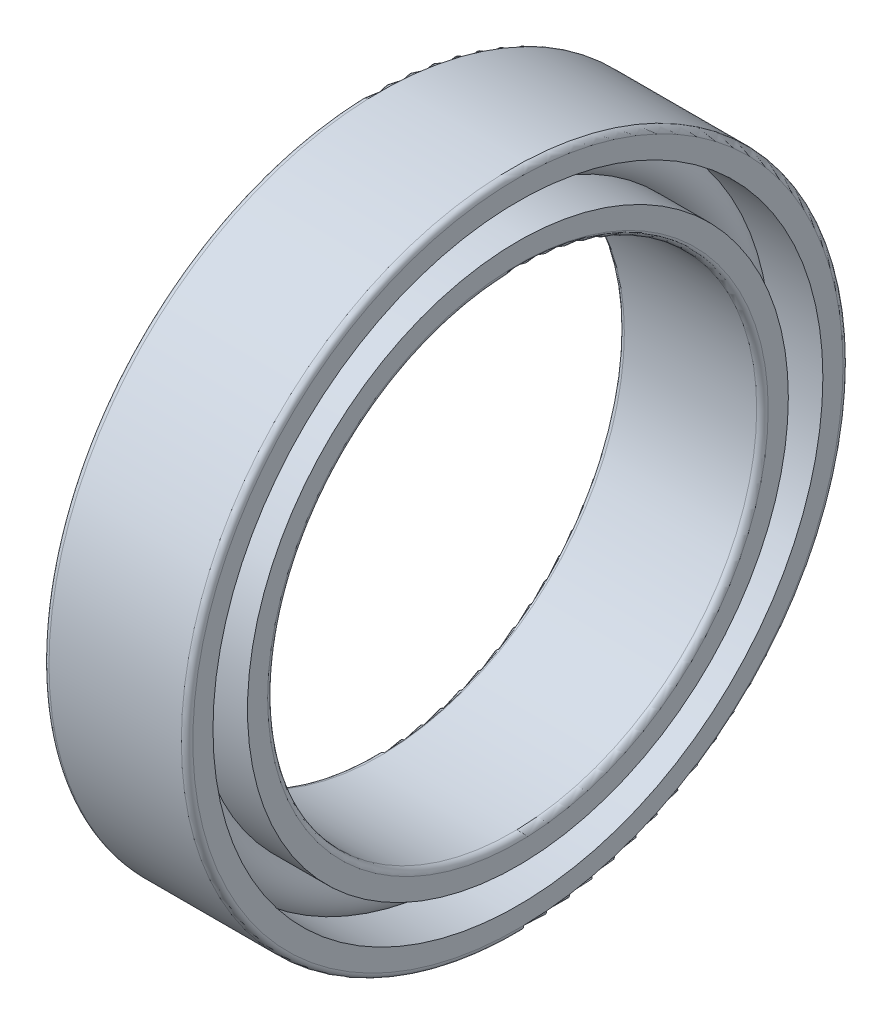
ISO-10303-21;
HEADER;
FILE_DESCRIPTION(('STEP AP214'),'2;1');
FILE_NAME('part.step','',(''),(''),'','','');
FILE_SCHEMA(('AUTOMOTIVE_DESIGN { 1 0 10303 214 1 1 1 1 }'));
ENDSEC;
DATA;
#1=APPLICATION_CONTEXT('core data for automotive mechanical design processes');
#2=APPLICATION_PROTOCOL_DEFINITION('international standard','automotive_design',2000,#1);
#3=PRODUCT_CONTEXT('',#1,'mechanical');
#4=PRODUCT('Part','Part','',(#3));
#5=PRODUCT_RELATED_PRODUCT_CATEGORY('part','',(#4));
#6=PRODUCT_DEFINITION_FORMATION('','',#4);
#7=PRODUCT_DEFINITION_CONTEXT('part definition',#1,'design');
#8=PRODUCT_DEFINITION('design','',#6,#7);
#9=PRODUCT_DEFINITION_SHAPE('','',#8);
#10=(LENGTH_UNIT() NAMED_UNIT(*) SI_UNIT(.MILLI.,.METRE.));
#11=(NAMED_UNIT(*) PLANE_ANGLE_UNIT() SI_UNIT($,.RADIAN.));
#12=(NAMED_UNIT(*) SI_UNIT($,.STERADIAN.) SOLID_ANGLE_UNIT());
#13=UNCERTAINTY_MEASURE_WITH_UNIT(LENGTH_MEASURE(1.E-05),#10,'distance_accuracy_value','');
#14=(GEOMETRIC_REPRESENTATION_CONTEXT(3) GLOBAL_UNCERTAINTY_ASSIGNED_CONTEXT((#13)) GLOBAL_UNIT_ASSIGNED_CONTEXT((#10,
#11,#12)) REPRESENTATION_CONTEXT('',''));
#15=CARTESIAN_POINT('',(0.,0.,0.));
#16=DIRECTION('',(0.,0.,1.));
#17=DIRECTION('',(1.,0.,0.));
#18=AXIS2_PLACEMENT_3D('',#15,#16,#17);
#19=CARTESIAN_POINT('',(0.,0.,0.));
#20=DIRECTION('',(-1.,0.,0.));
#21=DIRECTION('',(0.,0.,1.));
#22=AXIS2_PLACEMENT_3D('',#19,#20,#21);
#23=TOROIDAL_SURFACE('',#22,10.,0.9);
#24=CARTESIAN_POINT('',(0.670820393249932,0.,0.));
#25=DIRECTION('',(-1.,0.,0.));
#26=DIRECTION('',(0.,0.,1.));
#27=AXIS2_PLACEMENT_3D('',#24,#25,#26);
#28=CIRCLE('',#27,10.6);
#29=CARTESIAN_POINT('',(0.670820393249932,0.,10.6));
#30=VERTEX_POINT('',#29);
#31=EDGE_CURVE('E41',#30,#30,#28,.F.);
#32=ORIENTED_EDGE('',*,*,#31,.T.);
#33=EDGE_LOOP('',(#32));
#34=FACE_BOUND('',#33,.T.);
#35=CARTESIAN_POINT('',(0.670820393249935,0.,0.));
#36=DIRECTION('',(-1.,0.,0.));
#37=DIRECTION('',(0.,0.,1.));
#38=AXIS2_PLACEMENT_3D('',#35,#36,#37);
#39=CIRCLE('',#38,9.4);
#40=CARTESIAN_POINT('',(0.670820393249935,0.,9.4));
#41=VERTEX_POINT('',#40);
#42=EDGE_CURVE('E10',#41,#41,#39,.T.);
#43=ORIENTED_EDGE('',*,*,#42,.T.);
#44=EDGE_LOOP('',(#43));
#45=FACE_BOUND('',#44,.T.);
#46=ADVANCED_FACE('F37',(#34,#45),#23,.T.);
#47=CARTESIAN_POINT('',(-20.6375,0.,0.));
#48=DIRECTION('',(1.,0.,0.));
#49=DIRECTION('',(0.,0.,-1.));
#50=AXIS2_PLACEMENT_3D('',#47,#48,#49);
#51=CYLINDRICAL_SURFACE('',#50,9.4);
#52=CARTESIAN_POINT('',(2.5,0.,0.));
#53=DIRECTION('',(1.,0.,0.));
#54=DIRECTION('',(0.,0.,-1.));
#55=AXIS2_PLACEMENT_3D('',#52,#53,#54);
#56=CIRCLE('',#55,9.4);
#57=CARTESIAN_POINT('',(2.5,0.,-9.4));
#58=VERTEX_POINT('',#57);
#59=EDGE_CURVE('E50',#58,#58,#56,.T.);
#60=ORIENTED_EDGE('',*,*,#59,.F.);
#61=EDGE_LOOP('',(#60));
#62=FACE_BOUND('',#61,.T.);
#63=ORIENTED_EDGE('',*,*,#42,.F.);
#64=EDGE_LOOP('',(#63));
#65=FACE_BOUND('',#64,.T.);
#66=ADVANCED_FACE('F89',(#62,#65),#51,.T.);
#67=CARTESIAN_POINT('',(-20.6375,0.,0.));
#68=DIRECTION('',(1.,0.,0.));
#69=DIRECTION('',(0.,0.,-1.));
#70=AXIS2_PLACEMENT_3D('',#67,#68,#69);
#71=CYLINDRICAL_SURFACE('',#70,9.4);
#72=CARTESIAN_POINT('',(-2.5,0.,0.));
#73=DIRECTION('',(1.,0.,0.));
#74=DIRECTION('',(0.,0.,-1.));
#75=AXIS2_PLACEMENT_3D('',#72,#73,#74);
#76=CIRCLE('',#75,9.4);
#77=CARTESIAN_POINT('',(-2.5,0.,-9.4));
#78=VERTEX_POINT('',#77);
#79=EDGE_CURVE('E59',#78,#78,#76,.T.);
#80=ORIENTED_EDGE('',*,*,#79,.T.);
#81=EDGE_LOOP('',(#80));
#82=FACE_BOUND('',#81,.T.);
#83=CARTESIAN_POINT('',(-0.670820393249935,0.,0.));
#84=DIRECTION('',(1.,0.,0.));
#85=DIRECTION('',(0.,0.,-1.));
#86=AXIS2_PLACEMENT_3D('',#83,#84,#85);
#87=CIRCLE('',#86,9.4);
#88=CARTESIAN_POINT('',(-0.670820393249935,0.,-9.4));
#89=VERTEX_POINT('',#88);
#90=EDGE_CURVE('E45',#89,#89,#87,.T.);
#91=ORIENTED_EDGE('',*,*,#90,.F.);
#92=EDGE_LOOP('',(#91));
#93=FACE_BOUND('',#92,.T.);
#94=ADVANCED_FACE('F92',(#82,#93),#71,.T.);
#95=CARTESIAN_POINT('',(2.5,8.7,0.));
#96=DIRECTION('',(1.,0.,0.));
#97=DIRECTION('',(0.,0.,-1.));
#98=AXIS2_PLACEMENT_3D('',#95,#96,#97);
#99=PLANE('',#98);
#100=ORIENTED_EDGE('',*,*,#59,.T.);
#101=EDGE_LOOP('',(#100));
#102=FACE_BOUND('',#101,.T.);
#103=CARTESIAN_POINT('',(2.5,0.,0.));
#104=DIRECTION('',(1.,0.,0.));
#105=DIRECTION('',(0.,0.,-1.));
#106=AXIS2_PLACEMENT_3D('',#103,#104,#105);
#107=CIRCLE('',#106,8.7);
#108=CARTESIAN_POINT('',(2.5,0.,-8.7));
#109=VERTEX_POINT('',#108);
#110=EDGE_CURVE('E81',#109,#109,#107,.T.);
#111=ORIENTED_EDGE('',*,*,#110,.F.);
#112=EDGE_LOOP('',(#111));
#113=FACE_BOUND('',#112,.T.);
#114=ADVANCED_FACE('F86',(#102,#113),#99,.T.);
#115=CARTESIAN_POINT('',(2.3,0.,0.));
#116=DIRECTION('',(1.,0.,0.));
#117=DIRECTION('',(0.,0.,-1.));
#118=AXIS2_PLACEMENT_3D('',#115,#116,#117);
#119=TOROIDAL_SURFACE('',#118,8.7,0.2);
#120=ORIENTED_EDGE('',*,*,#110,.T.);
#121=EDGE_LOOP('',(#120));
#122=FACE_BOUND('',#121,.T.);
#123=CARTESIAN_POINT('',(2.3,0.,0.));
#124=DIRECTION('',(1.,0.,0.));
#125=DIRECTION('',(0.,0.,-1.));
#126=AXIS2_PLACEMENT_3D('',#123,#124,#125);
#127=CIRCLE('',#126,8.5);
#128=CARTESIAN_POINT('',(2.3,0.,-8.5));
#129=VERTEX_POINT('',#128);
#130=EDGE_CURVE('E78',#129,#129,#127,.T.);
#131=ORIENTED_EDGE('',*,*,#130,.F.);
#132=EDGE_LOOP('',(#131));
#133=FACE_BOUND('',#132,.T.);
#134=ADVANCED_FACE('F103',(#122,#133),#119,.T.);
#135=CARTESIAN_POINT('',(-20.6375,0.,0.));
#136=DIRECTION('',(1.,0.,0.));
#137=DIRECTION('',(0.,0.,-1.));
#138=AXIS2_PLACEMENT_3D('',#135,#136,#137);
#139=CYLINDRICAL_SURFACE('',#138,8.5);
#140=ORIENTED_EDGE('',*,*,#130,.T.);
#141=EDGE_LOOP('',(#140));
#142=FACE_BOUND('',#141,.T.);
#143=CARTESIAN_POINT('',(-2.3,0.,0.));
#144=DIRECTION('',(1.,0.,0.));
#145=DIRECTION('',(0.,0.,-1.));
#146=AXIS2_PLACEMENT_3D('',#143,#144,#145);
#147=CIRCLE('',#146,8.5);
#148=CARTESIAN_POINT('',(-2.3,0.,-8.5));
#149=VERTEX_POINT('',#148);
#150=EDGE_CURVE('E75',#149,#149,#147,.T.);
#151=ORIENTED_EDGE('',*,*,#150,.F.);
#152=EDGE_LOOP('',(#151));
#153=FACE_BOUND('',#152,.T.);
#154=ADVANCED_FACE('F106',(#142,#153),#139,.F.);
#155=CARTESIAN_POINT('',(-2.3,0.,0.));
#156=DIRECTION('',(1.,0.,0.));
#157=DIRECTION('',(0.,0.,-1.));
#158=AXIS2_PLACEMENT_3D('',#155,#156,#157);
#159=TOROIDAL_SURFACE('',#158,8.7,0.2);
#160=ORIENTED_EDGE('',*,*,#150,.T.);
#161=EDGE_LOOP('',(#160));
#162=FACE_BOUND('',#161,.T.);
#163=CARTESIAN_POINT('',(-2.5,0.,0.));
#164=DIRECTION('',(1.,0.,0.));
#165=DIRECTION('',(0.,0.,-1.));
#166=AXIS2_PLACEMENT_3D('',#163,#164,#165);
#167=CIRCLE('',#166,8.7);
#168=CARTESIAN_POINT('',(-2.5,0.,-8.7));
#169=VERTEX_POINT('',#168);
#170=EDGE_CURVE('E72',#169,#169,#167,.T.);
#171=ORIENTED_EDGE('',*,*,#170,.F.);
#172=EDGE_LOOP('',(#171));
#173=FACE_BOUND('',#172,.T.);
#174=ADVANCED_FACE('F110',(#162,#173),#159,.T.);
#175=CARTESIAN_POINT('',(-2.5,9.4,0.));
#176=DIRECTION('',(-1.,0.,0.));
#177=DIRECTION('',(0.,0.,1.));
#178=AXIS2_PLACEMENT_3D('',#175,#176,#177);
#179=PLANE('',#178);
#180=ORIENTED_EDGE('',*,*,#170,.T.);
#181=EDGE_LOOP('',(#180));
#182=FACE_BOUND('',#181,.T.);
#183=ORIENTED_EDGE('',*,*,#79,.F.);
#184=EDGE_LOOP('',(#183));
#185=FACE_BOUND('',#184,.T.);
#186=ADVANCED_FACE('F114',(#182,#185),#179,.T.);
#187=CARTESIAN_POINT('',(-0.670820393249932,0.,0.));
#188=DIRECTION('',(1.,0.,0.));
#189=DIRECTION('',(0.,0.,-1.));
#190=AXIS2_PLACEMENT_3D('',#187,#188,#189);
#191=CIRCLE('',#190,10.6);
#192=CARTESIAN_POINT('',(-0.670820393249932,0.,-10.6));
#193=VERTEX_POINT('',#192);
#194=EDGE_CURVE('E53',#193,#193,#191,.F.);
#195=ORIENTED_EDGE('',*,*,#194,.T.);
#196=EDGE_LOOP('',(#195));
#197=FACE_BOUND('',#196,.T.);
#198=ORIENTED_EDGE('',*,*,#90,.T.);
#199=EDGE_LOOP('',(#198));
#200=FACE_BOUND('',#199,.T.);
#201=ADVANCED_FACE('F39',(#197,#200),#23,.T.);
#202=CARTESIAN_POINT('',(-20.6375,0.,0.));
#203=DIRECTION('',(1.,0.,0.));
#204=DIRECTION('',(0.,0.,-1.));
#205=AXIS2_PLACEMENT_3D('',#202,#203,#204);
#206=CYLINDRICAL_SURFACE('',#205,10.6);
#207=CARTESIAN_POINT('',(2.5,0.,0.));
#208=DIRECTION('',(1.,0.,0.));
#209=DIRECTION('',(0.,0.,-1.));
#210=AXIS2_PLACEMENT_3D('',#207,#208,#209);
#211=CIRCLE('',#210,10.6);
#212=CARTESIAN_POINT('',(2.5,0.,-10.6));
#213=VERTEX_POINT('',#212);
#214=EDGE_CURVE('E55',#213,#213,#211,.T.);
#215=ORIENTED_EDGE('',*,*,#214,.T.);
#216=EDGE_LOOP('',(#215));
#217=FACE_BOUND('',#216,.T.);
#218=ORIENTED_EDGE('',*,*,#31,.F.);
#219=EDGE_LOOP('',(#218));
#220=FACE_BOUND('',#219,.T.);
#221=ADVANCED_FACE('F119',(#217,#220),#206,.F.);
#222=CARTESIAN_POINT('',(-20.6375,0.,0.));
#223=DIRECTION('',(1.,0.,0.));
#224=DIRECTION('',(0.,0.,-1.));
#225=AXIS2_PLACEMENT_3D('',#222,#223,#224);
#226=CYLINDRICAL_SURFACE('',#225,10.6);
#227=CARTESIAN_POINT('',(-2.5,0.,0.));
#228=DIRECTION('',(1.,0.,0.));
#229=DIRECTION('',(0.,0.,-1.));
#230=AXIS2_PLACEMENT_3D('',#227,#228,#229);
#231=CIRCLE('',#230,10.6);
#232=CARTESIAN_POINT('',(-2.5,0.,-10.6));
#233=VERTEX_POINT('',#232);
#234=EDGE_CURVE('E150',#233,#233,#231,.T.);
#235=ORIENTED_EDGE('',*,*,#234,.F.);
#236=EDGE_LOOP('',(#235));
#237=FACE_BOUND('',#236,.T.);
#238=ORIENTED_EDGE('',*,*,#194,.F.);
#239=EDGE_LOOP('',(#238));
#240=FACE_BOUND('',#239,.T.);
#241=ADVANCED_FACE('F122',(#237,#240),#226,.F.);
#242=CARTESIAN_POINT('',(2.5,11.3,0.));
#243=DIRECTION('',(1.,0.,0.));
#244=DIRECTION('',(0.,0.,-1.));
#245=AXIS2_PLACEMENT_3D('',#242,#243,#244);
#246=PLANE('',#245);
#247=CARTESIAN_POINT('',(2.5,0.,0.));
#248=DIRECTION('',(1.,0.,0.));
#249=DIRECTION('',(0.,0.,-1.));
#250=AXIS2_PLACEMENT_3D('',#247,#248,#249);
#251=CIRCLE('',#250,11.3);
#252=CARTESIAN_POINT('',(2.5,0.,-11.3));
#253=VERTEX_POINT('',#252);
#254=EDGE_CURVE('E61',#253,#253,#251,.T.);
#255=ORIENTED_EDGE('',*,*,#254,.T.);
#256=EDGE_LOOP('',(#255));
#257=FACE_BOUND('',#256,.T.);
#258=ORIENTED_EDGE('',*,*,#214,.F.);
#259=EDGE_LOOP('',(#258));
#260=FACE_BOUND('',#259,.T.);
#261=ADVANCED_FACE('F123',(#257,#260),#246,.T.);
#262=CARTESIAN_POINT('',(2.3,0.,0.));
#263=DIRECTION('',(1.,0.,0.));
#264=DIRECTION('',(0.,0.,-1.));
#265=AXIS2_PLACEMENT_3D('',#262,#263,#264);
#266=TOROIDAL_SURFACE('',#265,11.3,0.2);
#267=CARTESIAN_POINT('',(2.3,0.,0.));
#268=DIRECTION('',(1.,0.,0.));
#269=DIRECTION('',(0.,0.,-1.));
#270=AXIS2_PLACEMENT_3D('',#267,#268,#269);
#271=CIRCLE('',#270,11.5);
#272=CARTESIAN_POINT('',(2.3,0.,-11.5));
#273=VERTEX_POINT('',#272);
#274=EDGE_CURVE('E66',#273,#273,#271,.T.);
#275=ORIENTED_EDGE('',*,*,#274,.T.);
#276=EDGE_LOOP('',(#275));
#277=FACE_BOUND('',#276,.T.);
#278=ORIENTED_EDGE('',*,*,#254,.F.);
#279=EDGE_LOOP('',(#278));
#280=FACE_BOUND('',#279,.T.);
#281=ADVANCED_FACE('F126',(#277,#280),#266,.T.);
#282=CARTESIAN_POINT('',(-20.6375,0.,0.));
#283=DIRECTION('',(1.,0.,0.));
#284=DIRECTION('',(0.,0.,-1.));
#285=AXIS2_PLACEMENT_3D('',#282,#283,#284);
#286=CYLINDRICAL_SURFACE('',#285,11.5);
#287=CARTESIAN_POINT('',(-2.3,0.,0.));
#288=DIRECTION('',(1.,0.,0.));
#289=DIRECTION('',(0.,0.,-1.));
#290=AXIS2_PLACEMENT_3D('',#287,#288,#289);
#291=CIRCLE('',#290,11.5);
#292=CARTESIAN_POINT('',(-2.3,0.,-11.5));
#293=VERTEX_POINT('',#292);
#294=EDGE_CURVE('E154',#293,#293,#291,.T.);
#295=ORIENTED_EDGE('',*,*,#294,.T.);
#296=EDGE_LOOP('',(#295));
#297=FACE_BOUND('',#296,.T.);
#298=ORIENTED_EDGE('',*,*,#274,.F.);
#299=EDGE_LOOP('',(#298));
#300=FACE_BOUND('',#299,.T.);
#301=ADVANCED_FACE('F130',(#297,#300),#286,.T.);
#302=CARTESIAN_POINT('',(-2.3,0.,0.));
#303=DIRECTION('',(1.,0.,0.));
#304=DIRECTION('',(0.,0.,-1.));
#305=AXIS2_PLACEMENT_3D('',#302,#303,#304);
#306=TOROIDAL_SURFACE('',#305,11.3,0.2);
#307=CARTESIAN_POINT('',(-2.5,0.,0.));
#308=DIRECTION('',(1.,0.,0.));
#309=DIRECTION('',(0.,0.,-1.));
#310=AXIS2_PLACEMENT_3D('',#307,#308,#309);
#311=CIRCLE('',#310,11.3);
#312=CARTESIAN_POINT('',(-2.5,0.,-11.3));
#313=VERTEX_POINT('',#312);
#314=EDGE_CURVE('E151',#313,#313,#311,.T.);
#315=ORIENTED_EDGE('',*,*,#314,.T.);
#316=EDGE_LOOP('',(#315));
#317=FACE_BOUND('',#316,.T.);
#318=ORIENTED_EDGE('',*,*,#294,.F.);
#319=EDGE_LOOP('',(#318));
#320=FACE_BOUND('',#319,.T.);
#321=ADVANCED_FACE('F134',(#317,#320),#306,.T.);
#322=CARTESIAN_POINT('',(-2.5,10.6,0.));
#323=DIRECTION('',(-1.,0.,0.));
#324=DIRECTION('',(0.,0.,1.));
#325=AXIS2_PLACEMENT_3D('',#322,#323,#324);
#326=PLANE('',#325);
#327=ORIENTED_EDGE('',*,*,#234,.T.);
#328=EDGE_LOOP('',(#327));
#329=FACE_BOUND('',#328,.T.);
#330=ORIENTED_EDGE('',*,*,#314,.F.);
#331=EDGE_LOOP('',(#330));
#332=FACE_BOUND('',#331,.T.);
#333=ADVANCED_FACE('F138',(#329,#332),#326,.T.);
#334=CLOSED_SHELL('',(#46,#66,#94,#114,#134,#154,#174,#186,#201,#221,#241,#261,#281,#301,#321,#333));
#335=MANIFOLD_SOLID_BREP('B2',#334);
#336=ADVANCED_BREP_SHAPE_REPRESENTATION('',(#18,#335),#14);
#337=SHAPE_DEFINITION_REPRESENTATION(#9,#336);
ENDSEC;
END-ISO-10303-21;
